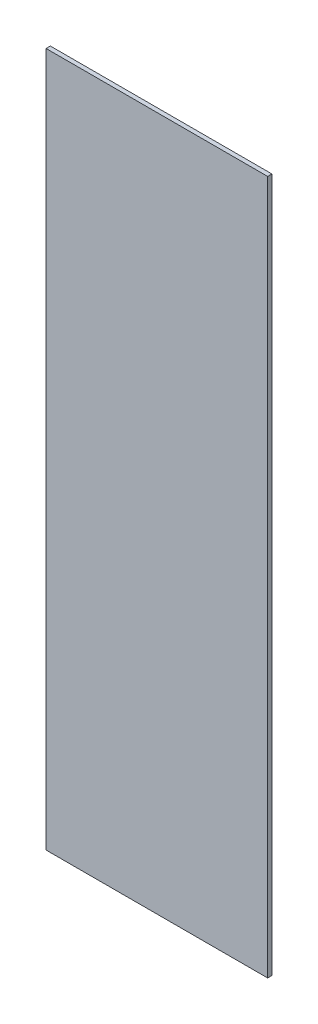
ISO-10303-21;
HEADER;
FILE_DESCRIPTION(('STEP AP214'),'2;1');
FILE_NAME('part.step','',(''),(''),'','','');
FILE_SCHEMA(('AUTOMOTIVE_DESIGN { 1 0 10303 214 1 1 1 1 }'));
ENDSEC;
DATA;
#1=APPLICATION_CONTEXT('core data for automotive mechanical design processes');
#2=APPLICATION_PROTOCOL_DEFINITION('international standard','automotive_design',2000,#1);
#3=PRODUCT_CONTEXT('',#1,'mechanical');
#4=PRODUCT('Part','Part','',(#3));
#5=PRODUCT_RELATED_PRODUCT_CATEGORY('part','',(#4));
#6=PRODUCT_DEFINITION_FORMATION('','',#4);
#7=PRODUCT_DEFINITION_CONTEXT('part definition',#1,'design');
#8=PRODUCT_DEFINITION('design','',#6,#7);
#9=PRODUCT_DEFINITION_SHAPE('','',#8);
#10=(LENGTH_UNIT() NAMED_UNIT(*) SI_UNIT(.MILLI.,.METRE.));
#11=(NAMED_UNIT(*) PLANE_ANGLE_UNIT() SI_UNIT($,.RADIAN.));
#12=(NAMED_UNIT(*) SI_UNIT($,.STERADIAN.) SOLID_ANGLE_UNIT());
#13=UNCERTAINTY_MEASURE_WITH_UNIT(LENGTH_MEASURE(1.E-05),#10,'distance_accuracy_value','');
#14=(GEOMETRIC_REPRESENTATION_CONTEXT(3) GLOBAL_UNCERTAINTY_ASSIGNED_CONTEXT((#13)) GLOBAL_UNIT_ASSIGNED_CONTEXT((#10,
#11,#12)) REPRESENTATION_CONTEXT('',''));
#15=CARTESIAN_POINT('',(0.,0.,0.));
#16=DIRECTION('',(0.,0.,1.));
#17=DIRECTION('',(1.,0.,0.));
#18=AXIS2_PLACEMENT_3D('',#15,#16,#17);
#19=CARTESIAN_POINT('',(-41.5,150.,1.6));
#20=DIRECTION('',(0.,-1.,0.));
#21=DIRECTION('',(0.,0.,-1.));
#22=AXIS2_PLACEMENT_3D('',#19,#20,#21);
#23=PLANE('',#22);
#24=DIRECTION('',(-1.,0.,0.));
#25=VECTOR('',#24,1.);
#26=CARTESIAN_POINT('',(-41.5,150.,0.));
#27=LINE('',#26,#25);
#28=CARTESIAN_POINT('',(41.5,150.,0.));
#29=VERTEX_POINT('',#28);
#30=CARTESIAN_POINT('',(-41.5,150.,0.));
#31=VERTEX_POINT('',#30);
#32=EDGE_CURVE('E95',#29,#31,#27,.T.);
#33=ORIENTED_EDGE('',*,*,#32,.T.);
#34=DIRECTION('',(0.,0.,-1.));
#35=VECTOR('',#34,1.);
#36=CARTESIAN_POINT('',(-41.5,150.,1.6));
#37=LINE('',#36,#35);
#38=CARTESIAN_POINT('',(-41.5,150.,1.6));
#39=VERTEX_POINT('',#38);
#40=EDGE_CURVE('E48',#39,#31,#37,.T.);
#41=ORIENTED_EDGE('',*,*,#40,.F.);
#42=DIRECTION('',(-1.,0.,0.));
#43=VECTOR('',#42,1.);
#44=CARTESIAN_POINT('',(-41.5,150.,1.6));
#45=LINE('',#44,#43);
#46=CARTESIAN_POINT('',(41.5,150.,1.6));
#47=VERTEX_POINT('',#46);
#48=EDGE_CURVE('E87',#47,#39,#45,.T.);
#49=ORIENTED_EDGE('',*,*,#48,.F.);
#50=DIRECTION('',(0.,0.,-1.));
#51=VECTOR('',#50,1.);
#52=CARTESIAN_POINT('',(41.5,150.,1.6));
#53=LINE('',#52,#51);
#54=EDGE_CURVE('E11',#47,#29,#53,.T.);
#55=ORIENTED_EDGE('',*,*,#54,.T.);
#56=EDGE_LOOP('',(#33,#41,#49,#55));
#57=FACE_BOUND('',#56,.T.);
#58=ADVANCED_FACE('F39',(#57),#23,.F.);
#59=CARTESIAN_POINT('',(-41.5,-50.,1.6));
#60=DIRECTION('',(1.,0.,0.));
#61=DIRECTION('',(0.,1.,0.));
#62=AXIS2_PLACEMENT_3D('',#59,#60,#61);
#63=PLANE('',#62);
#64=DIRECTION('',(0.,-1.,0.));
#65=VECTOR('',#64,1.);
#66=CARTESIAN_POINT('',(-41.5,-50.,0.));
#67=LINE('',#66,#65);
#68=CARTESIAN_POINT('',(-41.5,-110.,0.));
#69=VERTEX_POINT('',#68);
#70=EDGE_CURVE('E73',#31,#69,#67,.T.);
#71=ORIENTED_EDGE('',*,*,#70,.T.);
#72=DIRECTION('',(0.,0.,-1.));
#73=VECTOR('',#72,1.);
#74=CARTESIAN_POINT('',(-41.5,-110.,1.6));
#75=LINE('',#74,#73);
#76=CARTESIAN_POINT('',(-41.5,-110.,1.6));
#77=VERTEX_POINT('',#76);
#78=EDGE_CURVE('E97',#77,#69,#75,.T.);
#79=ORIENTED_EDGE('',*,*,#78,.F.);
#80=DIRECTION('',(0.,-1.,0.));
#81=VECTOR('',#80,1.);
#82=CARTESIAN_POINT('',(-41.5,50.,1.6));
#83=LINE('',#82,#81);
#84=EDGE_CURVE('E91',#39,#77,#83,.T.);
#85=ORIENTED_EDGE('',*,*,#84,.F.);
#86=ORIENTED_EDGE('',*,*,#40,.T.);
#87=EDGE_LOOP('',(#71,#79,#85,#86));
#88=FACE_BOUND('',#87,.T.);
#89=ADVANCED_FACE('F98',(#88),#63,.F.);
#90=CARTESIAN_POINT('',(41.5,-110.,1.6));
#91=DIRECTION('',(0.,1.,0.));
#92=DIRECTION('',(0.,0.,1.));
#93=AXIS2_PLACEMENT_3D('',#90,#91,#92);
#94=PLANE('',#93);
#95=DIRECTION('',(1.,0.,0.));
#96=VECTOR('',#95,1.);
#97=CARTESIAN_POINT('',(41.5,-110.,0.));
#98=LINE('',#97,#96);
#99=CARTESIAN_POINT('',(41.5,-110.,0.));
#100=VERTEX_POINT('',#99);
#101=EDGE_CURVE('E112',#69,#100,#98,.T.);
#102=ORIENTED_EDGE('',*,*,#101,.T.);
#103=DIRECTION('',(0.,0.,-1.));
#104=VECTOR('',#103,1.);
#105=CARTESIAN_POINT('',(41.5,-110.,1.6));
#106=LINE('',#105,#104);
#107=CARTESIAN_POINT('',(41.5,-110.,1.6));
#108=VERTEX_POINT('',#107);
#109=EDGE_CURVE('E104',#108,#100,#106,.T.);
#110=ORIENTED_EDGE('',*,*,#109,.F.);
#111=DIRECTION('',(1.,0.,0.));
#112=VECTOR('',#111,1.);
#113=CARTESIAN_POINT('',(41.5,-110.,1.6));
#114=LINE('',#113,#112);
#115=EDGE_CURVE('E101',#77,#108,#114,.T.);
#116=ORIENTED_EDGE('',*,*,#115,.F.);
#117=ORIENTED_EDGE('',*,*,#78,.T.);
#118=EDGE_LOOP('',(#102,#110,#116,#117));
#119=FACE_BOUND('',#118,.T.);
#120=ADVANCED_FACE('F121',(#119),#94,.F.);
#121=CARTESIAN_POINT('',(41.5,-50.,1.6));
#122=DIRECTION('',(-1.,0.,0.));
#123=DIRECTION('',(0.,0.,1.));
#124=AXIS2_PLACEMENT_3D('',#121,#122,#123);
#125=PLANE('',#124);
#126=DIRECTION('',(0.,1.,0.));
#127=VECTOR('',#126,1.);
#128=CARTESIAN_POINT('',(41.5,-50.,0.));
#129=LINE('',#128,#127);
#130=EDGE_CURVE('E80',#100,#29,#129,.T.);
#131=ORIENTED_EDGE('',*,*,#130,.T.);
#132=ORIENTED_EDGE('',*,*,#54,.F.);
#133=DIRECTION('',(0.,1.,0.));
#134=VECTOR('',#133,1.);
#135=CARTESIAN_POINT('',(41.5,50.,1.6));
#136=LINE('',#135,#134);
#137=EDGE_CURVE('E56',#108,#47,#136,.T.);
#138=ORIENTED_EDGE('',*,*,#137,.F.);
#139=ORIENTED_EDGE('',*,*,#109,.T.);
#140=EDGE_LOOP('',(#131,#132,#138,#139));
#141=FACE_BOUND('',#140,.T.);
#142=ADVANCED_FACE('F124',(#141),#125,.F.);
#143=CARTESIAN_POINT('',(0.,0.,1.6));
#144=DIRECTION('',(0.,0.,-1.));
#145=DIRECTION('',(-1.,0.,0.));
#146=AXIS2_PLACEMENT_3D('',#143,#144,#145);
#147=PLANE('',#146);
#148=ORIENTED_EDGE('',*,*,#137,.T.);
#149=ORIENTED_EDGE('',*,*,#48,.T.);
#150=ORIENTED_EDGE('',*,*,#84,.T.);
#151=ORIENTED_EDGE('',*,*,#115,.T.);
#152=EDGE_LOOP('',(#148,#149,#150,#151));
#153=FACE_BOUND('',#152,.T.);
#154=ADVANCED_FACE('F89',(#153),#147,.F.);
#155=CARTESIAN_POINT('',(0.,0.,0.));
#156=DIRECTION('',(0.,0.,-1.));
#157=DIRECTION('',(-1.,0.,0.));
#158=AXIS2_PLACEMENT_3D('',#155,#156,#157);
#159=PLANE('',#158);
#160=ORIENTED_EDGE('',*,*,#32,.F.);
#161=ORIENTED_EDGE('',*,*,#130,.F.);
#162=ORIENTED_EDGE('',*,*,#101,.F.);
#163=ORIENTED_EDGE('',*,*,#70,.F.);
#164=EDGE_LOOP('',(#160,#161,#162,#163));
#165=FACE_BOUND('',#164,.T.);
#166=ADVANCED_FACE('F123',(#165),#159,.T.);
#167=CLOSED_SHELL('',(#58,#89,#120,#142,#154,#166));
#168=MANIFOLD_SOLID_BREP('B2',#167);
#169=ADVANCED_BREP_SHAPE_REPRESENTATION('',(#18,#168),#14);
#170=SHAPE_DEFINITION_REPRESENTATION(#9,#169);
ENDSEC;
END-ISO-10303-21;
